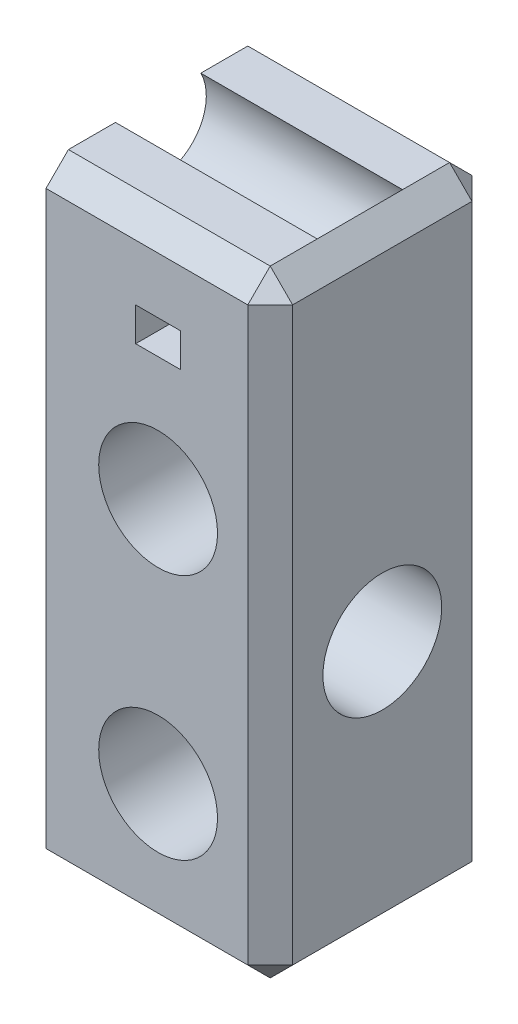
ISO-10303-21;
HEADER;
FILE_DESCRIPTION(('STEP AP214'),'2;1');
FILE_NAME('part.step','',(''),(''),'','','');
FILE_SCHEMA(('AUTOMOTIVE_DESIGN { 1 0 10303 214 1 1 1 1 }'));
ENDSEC;
DATA;
#1=APPLICATION_CONTEXT('core data for automotive mechanical design processes');
#2=APPLICATION_PROTOCOL_DEFINITION('international standard','automotive_design',2000,#1);
#3=PRODUCT_CONTEXT('',#1,'mechanical');
#4=PRODUCT('Part','Part','',(#3));
#5=PRODUCT_RELATED_PRODUCT_CATEGORY('part','',(#4));
#6=PRODUCT_DEFINITION_FORMATION('','',#4);
#7=PRODUCT_DEFINITION_CONTEXT('part definition',#1,'design');
#8=PRODUCT_DEFINITION('design','',#6,#7);
#9=PRODUCT_DEFINITION_SHAPE('','',#8);
#10=(LENGTH_UNIT() NAMED_UNIT(*) SI_UNIT(.MILLI.,.METRE.));
#11=(NAMED_UNIT(*) PLANE_ANGLE_UNIT() SI_UNIT($,.RADIAN.));
#12=(NAMED_UNIT(*) SI_UNIT($,.STERADIAN.) SOLID_ANGLE_UNIT());
#13=UNCERTAINTY_MEASURE_WITH_UNIT(LENGTH_MEASURE(1.E-05),#10,'distance_accuracy_value','');
#14=(GEOMETRIC_REPRESENTATION_CONTEXT(3) GLOBAL_UNCERTAINTY_ASSIGNED_CONTEXT((#13)) GLOBAL_UNIT_ASSIGNED_CONTEXT((#10,
#11,#12)) REPRESENTATION_CONTEXT('',''));
#15=CARTESIAN_POINT('',(0.,0.,0.));
#16=DIRECTION('',(0.,0.,1.));
#17=DIRECTION('',(1.,0.,0.));
#18=AXIS2_PLACEMENT_3D('',#15,#16,#17);
#19=CARTESIAN_POINT('',(0.,55.,0.));
#20=DIRECTION('',(0.,1.,0.));
#21=DIRECTION('',(0.,0.,1.));
#22=AXIS2_PLACEMENT_3D('',#19,#20,#21);
#23=PLANE('',#22);
#24=DIRECTION('',(0.,0.,-1.));
#25=VECTOR('',#24,1.);
#26=CARTESIAN_POINT('',(8.,55.,-10.));
#27=LINE('',#26,#25);
#28=CARTESIAN_POINT('',(8.,55.,-3.80657326213485));
#29=VERTEX_POINT('',#28);
#30=CARTESIAN_POINT('',(8.,55.,-8.));
#31=VERTEX_POINT('',#30);
#32=EDGE_CURVE('E42',#29,#31,#27,.T.);
#33=ORIENTED_EDGE('',*,*,#32,.T.);
#34=DIRECTION('',(-1.,0.,0.));
#35=VECTOR('',#34,1.);
#36=CARTESIAN_POINT('',(-10.,55.,-8.));
#37=LINE('',#36,#35);
#38=CARTESIAN_POINT('',(-10.,55.,-8.));
#39=VERTEX_POINT('',#38);
#40=EDGE_CURVE('E11',#31,#39,#37,.T.);
#41=ORIENTED_EDGE('',*,*,#40,.T.);
#42=DIRECTION('',(0.,0.,1.));
#43=VECTOR('',#42,1.);
#44=CARTESIAN_POINT('',(-10.,55.,-10.));
#45=LINE('',#44,#43);
#46=CARTESIAN_POINT('',(-10.,55.,-3.80657326213485));
#47=VERTEX_POINT('',#46);
#48=EDGE_CURVE('E173',#39,#47,#45,.T.);
#49=ORIENTED_EDGE('',*,*,#48,.T.);
#50=DIRECTION('',(-1.,0.,0.));
#51=VECTOR('',#50,1.);
#52=CARTESIAN_POINT('',(8.,55.,-3.80657326213485));
#53=LINE('',#52,#51);
#54=EDGE_CURVE('E155',#29,#47,#53,.T.);
#55=ORIENTED_EDGE('',*,*,#54,.F.);
#56=EDGE_LOOP('',(#33,#41,#49,#55));
#57=FACE_BOUND('',#56,.T.);
#58=ADVANCED_FACE('F33',(#57),#23,.T.);
#59=CARTESIAN_POINT('',(-10.,55.,-10.));
#60=DIRECTION('',(1.,0.,0.));
#61=DIRECTION('',(0.,0.,-1.));
#62=AXIS2_PLACEMENT_3D('',#59,#60,#61);
#63=PLANE('',#62);
#64=CARTESIAN_POINT('',(-10.,23.,0.));
#65=DIRECTION('',(-1.,0.,0.));
#66=DIRECTION('',(0.,0.,1.));
#67=AXIS2_PLACEMENT_3D('',#64,#65,#66);
#68=CIRCLE('',#67,5.3);
#69=CARTESIAN_POINT('',(-10.,23.,5.3));
#70=VERTEX_POINT('',#69);
#71=EDGE_CURVE('E297',#70,#70,#68,.T.);
#72=ORIENTED_EDGE('',*,*,#71,.F.);
#73=EDGE_LOOP('',(#72));
#74=FACE_BOUND('',#73,.T.);
#75=DIRECTION('',(0.,-1.,0.));
#76=VECTOR('',#75,1.);
#77=CARTESIAN_POINT('',(-10.,55.,-10.));
#78=LINE('',#77,#76);
#79=CARTESIAN_POINT('',(-10.,53.,-10.));
#80=VERTEX_POINT('',#79);
#81=CARTESIAN_POINT('',(-10.,2.,-10.));
#82=VERTEX_POINT('',#81);
#83=EDGE_CURVE('E176',#80,#82,#78,.T.);
#84=ORIENTED_EDGE('',*,*,#83,.T.);
#85=DIRECTION('',(0.,0.707106781186548,-0.707106781186548));
#86=VECTOR('',#85,1.);
#87=CARTESIAN_POINT('',(-10.,2.,-10.));
#88=LINE('',#87,#86);
#89=CARTESIAN_POINT('',(-10.,0.,-8.));
#90=VERTEX_POINT('',#89);
#91=EDGE_CURVE('E201',#82,#90,#88,.F.);
#92=ORIENTED_EDGE('',*,*,#91,.T.);
#93=DIRECTION('',(0.,0.,1.));
#94=VECTOR('',#93,1.);
#95=CARTESIAN_POINT('',(-10.,0.,-10.));
#96=LINE('',#95,#94);
#97=CARTESIAN_POINT('',(-10.,0.,8.));
#98=VERTEX_POINT('',#97);
#99=EDGE_CURVE('E174',#90,#98,#96,.T.);
#100=ORIENTED_EDGE('',*,*,#99,.T.);
#101=DIRECTION('',(0.,-0.707106781186548,-0.707106781186548));
#102=VECTOR('',#101,1.);
#103=CARTESIAN_POINT('',(-10.,2.,10.));
#104=LINE('',#103,#102);
#105=CARTESIAN_POINT('',(-10.,2.,10.));
#106=VERTEX_POINT('',#105);
#107=EDGE_CURVE('E199',#98,#106,#104,.F.);
#108=ORIENTED_EDGE('',*,*,#107,.T.);
#109=DIRECTION('',(0.,-1.,0.));
#110=VECTOR('',#109,1.);
#111=CARTESIAN_POINT('',(-10.,55.,10.));
#112=LINE('',#111,#110);
#113=CARTESIAN_POINT('',(-10.,53.,10.));
#114=VERTEX_POINT('',#113);
#115=EDGE_CURVE('E184',#114,#106,#112,.T.);
#116=ORIENTED_EDGE('',*,*,#115,.F.);
#117=DIRECTION('',(0.,0.707106781186548,-0.707106781186548));
#118=VECTOR('',#117,1.);
#119=CARTESIAN_POINT('',(-10.,55.,8.));
#120=LINE('',#119,#118);
#121=CARTESIAN_POINT('',(-10.,55.,8.));
#122=VERTEX_POINT('',#121);
#123=EDGE_CURVE('E172',#114,#122,#120,.T.);
#124=ORIENTED_EDGE('',*,*,#123,.T.);
#125=CARTESIAN_POINT('',(-10.,55.,3.80657326213486));
#126=VERTEX_POINT('',#125);
#127=EDGE_CURVE('E162',#126,#122,#45,.T.);
#128=ORIENTED_EDGE('',*,*,#127,.F.);
#129=CARTESIAN_POINT('',(-10.,53.,0.));
#130=DIRECTION('',(-1.,0.,0.));
#131=DIRECTION('',(0.,0.,1.));
#132=AXIS2_PLACEMENT_3D('',#129,#130,#131);
#133=CIRCLE('',#132,4.3);
#134=EDGE_CURVE('E149',#47,#126,#133,.T.);
#135=ORIENTED_EDGE('',*,*,#134,.F.);
#136=ORIENTED_EDGE('',*,*,#48,.F.);
#137=DIRECTION('',(0.,-0.707106781186548,-0.707106781186548));
#138=VECTOR('',#137,1.);
#139=CARTESIAN_POINT('',(-10.,55.,-8.));
#140=LINE('',#139,#138);
#141=EDGE_CURVE('E197',#39,#80,#140,.T.);
#142=ORIENTED_EDGE('',*,*,#141,.T.);
#143=EDGE_LOOP('',(#84,#92,#100,#108,#116,#124,#128,#135,#136,#142));
#144=FACE_BOUND('',#143,.T.);
#145=ADVANCED_FACE('F169',(#74,#144),#63,.F.);
#146=CARTESIAN_POINT('',(-10.,55.,10.));
#147=DIRECTION('',(0.,0.,-1.));
#148=DIRECTION('',(-1.,0.,0.));
#149=AXIS2_PLACEMENT_3D('',#146,#147,#148);
#150=PLANE('',#149);
#151=ORIENTED_EDGE('',*,*,#115,.T.);
#152=DIRECTION('',(1.,0.,0.));
#153=VECTOR('',#152,1.);
#154=CARTESIAN_POINT('',(-10.,2.,10.));
#155=LINE('',#154,#153);
#156=CARTESIAN_POINT('',(8.,2.,10.));
#157=VERTEX_POINT('',#156);
#158=EDGE_CURVE('E222',#106,#157,#155,.T.);
#159=ORIENTED_EDGE('',*,*,#158,.T.);
#160=DIRECTION('',(0.,1.,0.));
#161=VECTOR('',#160,1.);
#162=CARTESIAN_POINT('',(8.,55.,10.));
#163=LINE('',#162,#161);
#164=CARTESIAN_POINT('',(8.,53.,10.));
#165=VERTEX_POINT('',#164);
#166=EDGE_CURVE('E218',#157,#165,#163,.T.);
#167=ORIENTED_EDGE('',*,*,#166,.T.);
#168=DIRECTION('',(-1.,0.,0.));
#169=VECTOR('',#168,1.);
#170=CARTESIAN_POINT('',(-10.,53.,10.));
#171=LINE('',#170,#169);
#172=EDGE_CURVE('E220',#165,#114,#171,.T.);
#173=ORIENTED_EDGE('',*,*,#172,.T.);
#174=EDGE_LOOP('',(#151,#159,#167,#173));
#175=FACE_BOUND('',#174,.T.);
#176=CARTESIAN_POINT('',(0.,34.,10.));
#177=DIRECTION('',(0.,0.,-1.));
#178=DIRECTION('',(-1.,0.,0.));
#179=AXIS2_PLACEMENT_3D('',#176,#177,#178);
#180=CIRCLE('',#179,5.3);
#181=CARTESIAN_POINT('',(-5.3,34.,10.));
#182=VERTEX_POINT('',#181);
#183=EDGE_CURVE('E569',#182,#182,#180,.T.);
#184=ORIENTED_EDGE('',*,*,#183,.T.);
#185=EDGE_LOOP('',(#184));
#186=FACE_BOUND('',#185,.T.);
#187=DIRECTION('',(-1.,0.,0.));
#188=VECTOR('',#187,1.);
#189=CARTESIAN_POINT('',(-10.,45.,10.));
#190=LINE('',#189,#188);
#191=CARTESIAN_POINT('',(2.,45.,10.));
#192=VERTEX_POINT('',#191);
#193=CARTESIAN_POINT('',(-2.,45.,10.));
#194=VERTEX_POINT('',#193);
#195=EDGE_CURVE('E583',#192,#194,#190,.T.);
#196=ORIENTED_EDGE('',*,*,#195,.T.);
#197=DIRECTION('',(0.,1.,0.));
#198=VECTOR('',#197,1.);
#199=CARTESIAN_POINT('',(-2.,55.,10.));
#200=LINE('',#199,#198);
#201=CARTESIAN_POINT('',(-2.,48.,10.));
#202=VERTEX_POINT('',#201);
#203=EDGE_CURVE('E572',#194,#202,#200,.T.);
#204=ORIENTED_EDGE('',*,*,#203,.T.);
#205=DIRECTION('',(1.,0.,0.));
#206=VECTOR('',#205,1.);
#207=CARTESIAN_POINT('',(-10.,48.,10.));
#208=LINE('',#207,#206);
#209=CARTESIAN_POINT('',(2.,48.,10.));
#210=VERTEX_POINT('',#209);
#211=EDGE_CURVE('E577',#202,#210,#208,.T.);
#212=ORIENTED_EDGE('',*,*,#211,.T.);
#213=DIRECTION('',(0.,-1.,0.));
#214=VECTOR('',#213,1.);
#215=CARTESIAN_POINT('',(2.,55.,10.));
#216=LINE('',#215,#214);
#217=EDGE_CURVE('E580',#210,#192,#216,.T.);
#218=ORIENTED_EDGE('',*,*,#217,.T.);
#219=EDGE_LOOP('',(#196,#204,#212,#218));
#220=FACE_BOUND('',#219,.T.);
#221=CARTESIAN_POINT('',(0.,12.,10.));
#222=DIRECTION('',(0.,0.,-1.));
#223=DIRECTION('',(-1.,0.,0.));
#224=AXIS2_PLACEMENT_3D('',#221,#222,#223);
#225=CIRCLE('',#224,5.3);
#226=CARTESIAN_POINT('',(-5.3,12.,10.));
#227=VERTEX_POINT('',#226);
#228=EDGE_CURVE('E178',#227,#227,#225,.T.);
#229=ORIENTED_EDGE('',*,*,#228,.T.);
#230=EDGE_LOOP('',(#229));
#231=FACE_BOUND('',#230,.T.);
#232=ADVANCED_FACE('F268',(#175,#186,#220,#231),#150,.F.);
#233=CARTESIAN_POINT('',(10.,55.,-10.));
#234=DIRECTION('',(-1.,0.,0.));
#235=DIRECTION('',(0.,0.,1.));
#236=AXIS2_PLACEMENT_3D('',#233,#234,#235);
#237=PLANE('',#236);
#238=DIRECTION('',(0.,-1.,0.));
#239=VECTOR('',#238,1.);
#240=CARTESIAN_POINT('',(10.,55.,8.));
#241=LINE('',#240,#239);
#242=CARTESIAN_POINT('',(10.,53.,8.));
#243=VERTEX_POINT('',#242);
#244=CARTESIAN_POINT('',(10.,2.,8.));
#245=VERTEX_POINT('',#244);
#246=EDGE_CURVE('E209',#243,#245,#241,.T.);
#247=ORIENTED_EDGE('',*,*,#246,.T.);
#248=DIRECTION('',(0.,0.,-1.));
#249=VECTOR('',#248,1.);
#250=CARTESIAN_POINT('',(10.,2.,-10.));
#251=LINE('',#250,#249);
#252=CARTESIAN_POINT('',(10.,2.,-8.));
#253=VERTEX_POINT('',#252);
#254=EDGE_CURVE('E215',#245,#253,#251,.T.);
#255=ORIENTED_EDGE('',*,*,#254,.T.);
#256=DIRECTION('',(0.,1.,0.));
#257=VECTOR('',#256,1.);
#258=CARTESIAN_POINT('',(10.,55.,-8.));
#259=LINE('',#258,#257);
#260=CARTESIAN_POINT('',(10.,53.,-8.));
#261=VERTEX_POINT('',#260);
#262=EDGE_CURVE('E213',#253,#261,#259,.T.);
#263=ORIENTED_EDGE('',*,*,#262,.T.);
#264=DIRECTION('',(0.,0.,1.));
#265=VECTOR('',#264,1.);
#266=CARTESIAN_POINT('',(10.,53.,10.));
#267=LINE('',#266,#265);
#268=EDGE_CURVE('E211',#261,#243,#267,.T.);
#269=ORIENTED_EDGE('',*,*,#268,.T.);
#270=EDGE_LOOP('',(#247,#255,#263,#269));
#271=FACE_BOUND('',#270,.T.);
#272=CARTESIAN_POINT('',(10.,23.,0.));
#273=DIRECTION('',(-1.,0.,0.));
#274=DIRECTION('',(0.,0.,1.));
#275=AXIS2_PLACEMENT_3D('',#272,#273,#274);
#276=CIRCLE('',#275,5.3);
#277=CARTESIAN_POINT('',(10.,23.,5.3));
#278=VERTEX_POINT('',#277);
#279=EDGE_CURVE('E610',#278,#278,#276,.T.);
#280=ORIENTED_EDGE('',*,*,#279,.T.);
#281=EDGE_LOOP('',(#280));
#282=FACE_BOUND('',#281,.T.);
#283=ADVANCED_FACE('F289',(#271,#282),#237,.F.);
#284=CARTESIAN_POINT('',(-10.,55.,-10.));
#285=DIRECTION('',(0.,0.,1.));
#286=DIRECTION('',(1.,0.,0.));
#287=AXIS2_PLACEMENT_3D('',#284,#285,#286);
#288=PLANE('',#287);
#289=CARTESIAN_POINT('',(0.,34.,-10.));
#290=DIRECTION('',(0.,0.,1.));
#291=DIRECTION('',(1.,0.,0.));
#292=AXIS2_PLACEMENT_3D('',#289,#290,#291);
#293=CIRCLE('',#292,5.3);
#294=CARTESIAN_POINT('',(5.3,34.,-10.));
#295=VERTEX_POINT('',#294);
#296=EDGE_CURVE('E586',#295,#295,#293,.T.);
#297=ORIENTED_EDGE('',*,*,#296,.T.);
#298=EDGE_LOOP('',(#297));
#299=FACE_BOUND('',#298,.T.);
#300=DIRECTION('',(-1.,0.,0.));
#301=VECTOR('',#300,1.);
#302=CARTESIAN_POINT('',(-2.,48.,-10.));
#303=LINE('',#302,#301);
#304=CARTESIAN_POINT('',(2.,48.,-10.));
#305=VERTEX_POINT('',#304);
#306=CARTESIAN_POINT('',(-2.,48.,-10.));
#307=VERTEX_POINT('',#306);
#308=EDGE_CURVE('E590',#305,#307,#303,.T.);
#309=ORIENTED_EDGE('',*,*,#308,.T.);
#310=DIRECTION('',(0.,-1.,0.));
#311=VECTOR('',#310,1.);
#312=CARTESIAN_POINT('',(-2.,48.,-10.));
#313=LINE('',#312,#311);
#314=CARTESIAN_POINT('',(-2.,45.,-10.));
#315=VERTEX_POINT('',#314);
#316=EDGE_CURVE('E607',#307,#315,#313,.T.);
#317=ORIENTED_EDGE('',*,*,#316,.T.);
#318=DIRECTION('',(1.,0.,0.));
#319=VECTOR('',#318,1.);
#320=CARTESIAN_POINT('',(-2.,45.,-10.));
#321=LINE('',#320,#319);
#322=CARTESIAN_POINT('',(2.,45.,-10.));
#323=VERTEX_POINT('',#322);
#324=EDGE_CURVE('E604',#315,#323,#321,.T.);
#325=ORIENTED_EDGE('',*,*,#324,.T.);
#326=DIRECTION('',(0.,1.,0.));
#327=VECTOR('',#326,1.);
#328=CARTESIAN_POINT('',(2.,48.,-10.));
#329=LINE('',#328,#327);
#330=EDGE_CURVE('E601',#323,#305,#329,.T.);
#331=ORIENTED_EDGE('',*,*,#330,.T.);
#332=EDGE_LOOP('',(#309,#317,#325,#331));
#333=FACE_BOUND('',#332,.T.);
#334=CARTESIAN_POINT('',(0.,12.,-10.));
#335=DIRECTION('',(0.,0.,1.));
#336=DIRECTION('',(1.,0.,0.));
#337=AXIS2_PLACEMENT_3D('',#334,#335,#336);
#338=CIRCLE('',#337,5.3);
#339=CARTESIAN_POINT('',(5.3,12.,-10.));
#340=VERTEX_POINT('',#339);
#341=EDGE_CURVE('E565',#340,#340,#338,.T.);
#342=ORIENTED_EDGE('',*,*,#341,.T.);
#343=EDGE_LOOP('',(#342));
#344=FACE_BOUND('',#343,.T.);
#345=DIRECTION('',(0.,-1.,0.));
#346=VECTOR('',#345,1.);
#347=CARTESIAN_POINT('',(8.,55.,-10.));
#348=LINE('',#347,#346);
#349=CARTESIAN_POINT('',(8.,53.,-10.));
#350=VERTEX_POINT('',#349);
#351=CARTESIAN_POINT('',(8.,2.,-10.));
#352=VERTEX_POINT('',#351);
#353=EDGE_CURVE('E191',#350,#352,#348,.T.);
#354=ORIENTED_EDGE('',*,*,#353,.T.);
#355=DIRECTION('',(-1.,0.,0.));
#356=VECTOR('',#355,1.);
#357=CARTESIAN_POINT('',(-10.,2.,-10.));
#358=LINE('',#357,#356);
#359=EDGE_CURVE('E193',#352,#82,#358,.T.);
#360=ORIENTED_EDGE('',*,*,#359,.T.);
#361=ORIENTED_EDGE('',*,*,#83,.F.);
#362=DIRECTION('',(1.,0.,0.));
#363=VECTOR('',#362,1.);
#364=CARTESIAN_POINT('',(10.,53.,-10.));
#365=LINE('',#364,#363);
#366=EDGE_CURVE('E189',#80,#350,#365,.T.);
#367=ORIENTED_EDGE('',*,*,#366,.T.);
#368=EDGE_LOOP('',(#354,#360,#361,#367));
#369=FACE_BOUND('',#368,.T.);
#370=ADVANCED_FACE('F307',(#299,#333,#344,#369),#288,.F.);
#371=DIRECTION('',(1.,0.,0.));
#372=VECTOR('',#371,1.);
#373=CARTESIAN_POINT('',(10.,55.,8.));
#374=LINE('',#373,#372);
#375=CARTESIAN_POINT('',(8.,55.,8.));
#376=VERTEX_POINT('',#375);
#377=EDGE_CURVE('E56',#122,#376,#374,.T.);
#378=ORIENTED_EDGE('',*,*,#377,.T.);
#379=DIRECTION('',(0.,0.,-1.));
#380=VECTOR('',#379,1.);
#381=CARTESIAN_POINT('',(8.,55.,-10.));
#382=LINE('',#381,#380);
#383=CARTESIAN_POINT('',(8.,55.,3.80657326213485));
#384=VERTEX_POINT('',#383);
#385=EDGE_CURVE('E164',#376,#384,#382,.T.);
#386=ORIENTED_EDGE('',*,*,#385,.T.);
#387=DIRECTION('',(-1.,0.,0.));
#388=VECTOR('',#387,1.);
#389=CARTESIAN_POINT('',(8.,55.,3.80657326213485));
#390=LINE('',#389,#388);
#391=EDGE_CURVE('E153',#126,#384,#390,.F.);
#392=ORIENTED_EDGE('',*,*,#391,.F.);
#393=ORIENTED_EDGE('',*,*,#127,.T.);
#394=EDGE_LOOP('',(#378,#386,#392,#393));
#395=FACE_BOUND('',#394,.T.);
#396=ADVANCED_FACE('F161',(#395),#23,.T.);
#397=CARTESIAN_POINT('',(0.,0.,0.));
#398=DIRECTION('',(0.,1.,0.));
#399=DIRECTION('',(0.,0.,1.));
#400=AXIS2_PLACEMENT_3D('',#397,#398,#399);
#401=PLANE('',#400);
#402=ORIENTED_EDGE('',*,*,#99,.F.);
#403=DIRECTION('',(1.,0.,0.));
#404=VECTOR('',#403,1.);
#405=CARTESIAN_POINT('',(0.,0.,-8.));
#406=LINE('',#405,#404);
#407=CARTESIAN_POINT('',(8.,0.,-8.));
#408=VERTEX_POINT('',#407);
#409=EDGE_CURVE('E207',#90,#408,#406,.T.);
#410=ORIENTED_EDGE('',*,*,#409,.T.);
#411=DIRECTION('',(0.,0.,1.));
#412=VECTOR('',#411,1.);
#413=CARTESIAN_POINT('',(8.,0.,0.));
#414=LINE('',#413,#412);
#415=CARTESIAN_POINT('',(8.,0.,8.));
#416=VERTEX_POINT('',#415);
#417=EDGE_CURVE('E205',#408,#416,#414,.T.);
#418=ORIENTED_EDGE('',*,*,#417,.T.);
#419=DIRECTION('',(-1.,0.,0.));
#420=VECTOR('',#419,1.);
#421=CARTESIAN_POINT('',(0.,0.,8.));
#422=LINE('',#421,#420);
#423=EDGE_CURVE('E203',#416,#98,#422,.T.);
#424=ORIENTED_EDGE('',*,*,#423,.T.);
#425=EDGE_LOOP('',(#402,#410,#418,#424));
#426=FACE_BOUND('',#425,.T.);
#427=ADVANCED_FACE('F314',(#426),#401,.F.);
#428=CARTESIAN_POINT('',(0.,12.,-10.));
#429=DIRECTION('',(0.,0.,1.));
#430=DIRECTION('',(1.,0.,0.));
#431=AXIS2_PLACEMENT_3D('',#428,#429,#430);
#432=CYLINDRICAL_SURFACE('',#431,5.3);
#433=ORIENTED_EDGE('',*,*,#341,.F.);
#434=EDGE_LOOP('',(#433));
#435=FACE_BOUND('',#434,.T.);
#436=ORIENTED_EDGE('',*,*,#228,.F.);
#437=EDGE_LOOP('',(#436));
#438=FACE_BOUND('',#437,.T.);
#439=ADVANCED_FACE('F345',(#435,#438),#432,.F.);
#440=CARTESIAN_POINT('',(-2.,48.,-10.));
#441=DIRECTION('',(-1.,0.,0.));
#442=DIRECTION('',(0.,-1.,0.));
#443=AXIS2_PLACEMENT_3D('',#440,#441,#442);
#444=PLANE('',#443);
#445=DIRECTION('',(0.,0.,1.));
#446=VECTOR('',#445,1.);
#447=CARTESIAN_POINT('',(-2.,45.,-10.));
#448=LINE('',#447,#446);
#449=EDGE_CURVE('E587',#315,#194,#448,.T.);
#450=ORIENTED_EDGE('',*,*,#449,.F.);
#451=ORIENTED_EDGE('',*,*,#316,.F.);
#452=DIRECTION('',(0.,0.,1.));
#453=VECTOR('',#452,1.);
#454=CARTESIAN_POINT('',(-2.,48.,-10.));
#455=LINE('',#454,#453);
#456=EDGE_CURVE('E596',#307,#202,#455,.T.);
#457=ORIENTED_EDGE('',*,*,#456,.T.);
#458=ORIENTED_EDGE('',*,*,#203,.F.);
#459=EDGE_LOOP('',(#450,#451,#457,#458));
#460=FACE_BOUND('',#459,.T.);
#461=ADVANCED_FACE('F498',(#460),#444,.F.);
#462=CARTESIAN_POINT('',(-2.,48.,-10.));
#463=DIRECTION('',(0.,1.,0.));
#464=DIRECTION('',(0.,0.,1.));
#465=AXIS2_PLACEMENT_3D('',#462,#463,#464);
#466=PLANE('',#465);
#467=ORIENTED_EDGE('',*,*,#456,.F.);
#468=ORIENTED_EDGE('',*,*,#308,.F.);
#469=DIRECTION('',(0.,0.,1.));
#470=VECTOR('',#469,1.);
#471=CARTESIAN_POINT('',(2.,48.,-10.));
#472=LINE('',#471,#470);
#473=EDGE_CURVE('E593',#305,#210,#472,.T.);
#474=ORIENTED_EDGE('',*,*,#473,.T.);
#475=ORIENTED_EDGE('',*,*,#211,.F.);
#476=EDGE_LOOP('',(#467,#468,#474,#475));
#477=FACE_BOUND('',#476,.T.);
#478=ADVANCED_FACE('F489',(#477),#466,.F.);
#479=CARTESIAN_POINT('',(2.,48.,-10.));
#480=DIRECTION('',(1.,0.,0.));
#481=DIRECTION('',(0.,0.,-1.));
#482=AXIS2_PLACEMENT_3D('',#479,#480,#481);
#483=PLANE('',#482);
#484=ORIENTED_EDGE('',*,*,#473,.F.);
#485=ORIENTED_EDGE('',*,*,#330,.F.);
#486=DIRECTION('',(0.,0.,1.));
#487=VECTOR('',#486,1.);
#488=CARTESIAN_POINT('',(2.,45.,-10.));
#489=LINE('',#488,#487);
#490=EDGE_CURVE('E589',#323,#192,#489,.T.);
#491=ORIENTED_EDGE('',*,*,#490,.T.);
#492=ORIENTED_EDGE('',*,*,#217,.F.);
#493=EDGE_LOOP('',(#484,#485,#491,#492));
#494=FACE_BOUND('',#493,.T.);
#495=ADVANCED_FACE('F480',(#494),#483,.F.);
#496=CARTESIAN_POINT('',(-2.,45.,-10.));
#497=DIRECTION('',(0.,-1.,0.));
#498=DIRECTION('',(0.,0.,-1.));
#499=AXIS2_PLACEMENT_3D('',#496,#497,#498);
#500=PLANE('',#499);
#501=ORIENTED_EDGE('',*,*,#490,.F.);
#502=ORIENTED_EDGE('',*,*,#324,.F.);
#503=ORIENTED_EDGE('',*,*,#449,.T.);
#504=ORIENTED_EDGE('',*,*,#195,.F.);
#505=EDGE_LOOP('',(#501,#502,#503,#504));
#506=FACE_BOUND('',#505,.T.);
#507=ADVANCED_FACE('F471',(#506),#500,.F.);
#508=CARTESIAN_POINT('',(0.,34.,-10.));
#509=DIRECTION('',(0.,0.,1.));
#510=DIRECTION('',(1.,0.,0.));
#511=AXIS2_PLACEMENT_3D('',#508,#509,#510);
#512=CYLINDRICAL_SURFACE('',#511,5.3);
#513=ORIENTED_EDGE('',*,*,#296,.F.);
#514=EDGE_LOOP('',(#513));
#515=FACE_BOUND('',#514,.T.);
#516=ORIENTED_EDGE('',*,*,#183,.F.);
#517=EDGE_LOOP('',(#516));
#518=FACE_BOUND('',#517,.T.);
#519=ADVANCED_FACE('F462',(#515,#518),#512,.F.);
#520=CARTESIAN_POINT('',(10.,23.,0.));
#521=DIRECTION('',(-1.,0.,0.));
#522=DIRECTION('',(0.,0.,1.));
#523=AXIS2_PLACEMENT_3D('',#520,#521,#522);
#524=CYLINDRICAL_SURFACE('',#523,5.3);
#525=ORIENTED_EDGE('',*,*,#279,.F.);
#526=EDGE_LOOP('',(#525));
#527=FACE_BOUND('',#526,.T.);
#528=ORIENTED_EDGE('',*,*,#71,.T.);
#529=EDGE_LOOP('',(#528));
#530=FACE_BOUND('',#529,.T.);
#531=ADVANCED_FACE('F454',(#527,#530),#524,.F.);
#532=CARTESIAN_POINT('',(8.,53.,0.));
#533=DIRECTION('',(-1.,0.,0.));
#534=DIRECTION('',(0.,0.,1.));
#535=AXIS2_PLACEMENT_3D('',#532,#533,#534);
#536=CYLINDRICAL_SURFACE('',#535,4.3);
#537=ORIENTED_EDGE('',*,*,#54,.T.);
#538=ORIENTED_EDGE('',*,*,#134,.T.);
#539=ORIENTED_EDGE('',*,*,#391,.T.);
#540=CARTESIAN_POINT('',(8.,53.,0.));
#541=DIRECTION('',(-1.,0.,0.));
#542=DIRECTION('',(0.,0.,1.));
#543=AXIS2_PLACEMENT_3D('',#540,#541,#542);
#544=CIRCLE('',#543,4.3);
#545=EDGE_CURVE('E159',#29,#384,#544,.T.);
#546=ORIENTED_EDGE('',*,*,#545,.F.);
#547=EDGE_LOOP('',(#537,#538,#539,#546));
#548=FACE_BOUND('',#547,.T.);
#549=ADVANCED_FACE('F151',(#548),#536,.F.);
#550=CARTESIAN_POINT('',(8.,53.,0.));
#551=DIRECTION('',(-1.,0.,0.));
#552=DIRECTION('',(0.,0.,1.));
#553=AXIS2_PLACEMENT_3D('',#550,#551,#552);
#554=PLANE('',#553);
#555=ORIENTED_EDGE('',*,*,#545,.T.);
#556=DIRECTION('',(0.,0.,1.));
#557=VECTOR('',#556,1.);
#558=CARTESIAN_POINT('',(8.,55.,0.));
#559=LINE('',#558,#557);
#560=EDGE_CURVE('E166',#29,#384,#559,.T.);
#561=ORIENTED_EDGE('',*,*,#560,.F.);
#562=EDGE_LOOP('',(#555,#561));
#563=FACE_BOUND('',#562,.T.);
#564=ADVANCED_FACE('F296',(#563),#554,.T.);
#565=CARTESIAN_POINT('',(0.,55.,8.));
#566=DIRECTION('',(0.,0.707106781186547,0.707106781186547));
#567=DIRECTION('',(-1.,0.,0.));
#568=AXIS2_PLACEMENT_3D('',#565,#566,#567);
#569=PLANE('',#568);
#570=DIRECTION('',(0.,-0.707106781186547,0.707106781186547));
#571=VECTOR('',#570,1.);
#572=CARTESIAN_POINT('',(8.,54.,9.));
#573=LINE('',#572,#571);
#574=EDGE_CURVE('E37',#376,#165,#573,.T.);
#575=ORIENTED_EDGE('',*,*,#574,.F.);
#576=ORIENTED_EDGE('',*,*,#377,.F.);
#577=ORIENTED_EDGE('',*,*,#123,.F.);
#578=ORIENTED_EDGE('',*,*,#172,.F.);
#579=EDGE_LOOP('',(#575,#576,#577,#578));
#580=FACE_BOUND('',#579,.T.);
#581=ADVANCED_FACE('F35',(#580),#569,.T.);
#582=CARTESIAN_POINT('',(10.,53.,8.));
#583=DIRECTION('',(0.577350269189626,0.577350269189626,0.577350269189626));
#584=DIRECTION('',(0.,-0.707106781186547,0.707106781186548));
#585=AXIS2_PLACEMENT_3D('',#582,#583,#584);
#586=PLANE('',#585);
#587=DIRECTION('',(-0.707106781186548,0.707106781186547,0.));
#588=VECTOR('',#587,1.);
#589=CARTESIAN_POINT('',(10.,53.,8.));
#590=LINE('',#589,#588);
#591=EDGE_CURVE('E253',#376,#243,#590,.F.);
#592=ORIENTED_EDGE('',*,*,#591,.F.);
#593=ORIENTED_EDGE('',*,*,#574,.T.);
#594=DIRECTION('',(-0.707106781186548,0.,0.707106781186548));
#595=VECTOR('',#594,1.);
#596=CARTESIAN_POINT('',(10.,53.,8.));
#597=LINE('',#596,#595);
#598=EDGE_CURVE('E255',#243,#165,#597,.T.);
#599=ORIENTED_EDGE('',*,*,#598,.F.);
#600=EDGE_LOOP('',(#592,#593,#599));
#601=FACE_BOUND('',#600,.T.);
#602=ADVANCED_FACE('F264',(#601),#586,.T.);
#603=CARTESIAN_POINT('',(-10.,2.,10.));
#604=DIRECTION('',(0.,0.707106781186547,-0.707106781186547));
#605=DIRECTION('',(1.,0.,0.));
#606=AXIS2_PLACEMENT_3D('',#603,#604,#605);
#607=PLANE('',#606);
#608=ORIENTED_EDGE('',*,*,#107,.F.);
#609=ORIENTED_EDGE('',*,*,#423,.F.);
#610=DIRECTION('',(0.,0.707106781186547,0.707106781186547));
#611=VECTOR('',#610,1.);
#612=CARTESIAN_POINT('',(8.,0.,8.));
#613=LINE('',#612,#611);
#614=EDGE_CURVE('E250',#157,#416,#613,.F.);
#615=ORIENTED_EDGE('',*,*,#614,.F.);
#616=ORIENTED_EDGE('',*,*,#158,.F.);
#617=EDGE_LOOP('',(#608,#609,#615,#616));
#618=FACE_BOUND('',#617,.T.);
#619=ADVANCED_FACE('F275',(#618),#607,.F.);
#620=CARTESIAN_POINT('',(10.,55.,8.));
#621=DIRECTION('',(-0.707106781186547,0.,-0.707106781186547));
#622=DIRECTION('',(0.,-1.,0.));
#623=AXIS2_PLACEMENT_3D('',#620,#621,#622);
#624=PLANE('',#623);
#625=ORIENTED_EDGE('',*,*,#598,.T.);
#626=ORIENTED_EDGE('',*,*,#166,.F.);
#627=DIRECTION('',(0.707106781186548,0.,-0.707106781186548));
#628=VECTOR('',#627,1.);
#629=CARTESIAN_POINT('',(9.00000000000001,2.,9.));
#630=LINE('',#629,#628);
#631=EDGE_CURVE('E247',#245,#157,#630,.F.);
#632=ORIENTED_EDGE('',*,*,#631,.F.);
#633=ORIENTED_EDGE('',*,*,#246,.F.);
#634=EDGE_LOOP('',(#625,#626,#632,#633));
#635=FACE_BOUND('',#634,.T.);
#636=ADVANCED_FACE('F278',(#635),#624,.F.);
#637=CARTESIAN_POINT('',(8.,55.,0.));
#638=DIRECTION('',(0.707106781186547,0.707106781186548,0.));
#639=DIRECTION('',(0.,0.,1.));
#640=AXIS2_PLACEMENT_3D('',#637,#638,#639);
#641=PLANE('',#640);
#642=ORIENTED_EDGE('',*,*,#591,.T.);
#643=ORIENTED_EDGE('',*,*,#268,.F.);
#644=DIRECTION('',(0.707106781186548,-0.707106781186547,0.));
#645=VECTOR('',#644,1.);
#646=CARTESIAN_POINT('',(10.,53.,-8.));
#647=LINE('',#646,#645);
#648=EDGE_CURVE('E244',#31,#261,#647,.T.);
#649=ORIENTED_EDGE('',*,*,#648,.F.);
#650=ORIENTED_EDGE('',*,*,#32,.F.);
#651=ORIENTED_EDGE('',*,*,#560,.T.);
#652=ORIENTED_EDGE('',*,*,#385,.F.);
#653=EDGE_LOOP('',(#642,#643,#649,#650,#651,#652));
#654=FACE_BOUND('',#653,.T.);
#655=ADVANCED_FACE('F294',(#654),#641,.T.);
#656=CARTESIAN_POINT('',(0.,55.,-8.));
#657=DIRECTION('',(0.,0.707106781186547,-0.707106781186547));
#658=DIRECTION('',(1.,0.,0.));
#659=AXIS2_PLACEMENT_3D('',#656,#657,#658);
#660=PLANE('',#659);
#661=ORIENTED_EDGE('',*,*,#141,.F.);
#662=ORIENTED_EDGE('',*,*,#40,.F.);
#663=DIRECTION('',(0.,0.707106781186547,0.707106781186547));
#664=VECTOR('',#663,1.);
#665=CARTESIAN_POINT('',(8.,54.,-9.));
#666=LINE('',#665,#664);
#667=EDGE_CURVE('E241',#350,#31,#666,.T.);
#668=ORIENTED_EDGE('',*,*,#667,.F.);
#669=ORIENTED_EDGE('',*,*,#366,.F.);
#670=EDGE_LOOP('',(#661,#662,#668,#669));
#671=FACE_BOUND('',#670,.T.);
#672=ADVANCED_FACE('F303',(#671),#660,.T.);
#673=CARTESIAN_POINT('',(8.,0.,8.));
#674=DIRECTION('',(0.577350269189626,-0.577350269189626,0.577350269189626));
#675=DIRECTION('',(0.,-0.707106781186547,-0.707106781186548));
#676=AXIS2_PLACEMENT_3D('',#673,#674,#675);
#677=PLANE('',#676);
#678=ORIENTED_EDGE('',*,*,#631,.T.);
#679=ORIENTED_EDGE('',*,*,#614,.T.);
#680=DIRECTION('',(-0.707106781186548,-0.707106781186547,0.));
#681=VECTOR('',#680,1.);
#682=CARTESIAN_POINT('',(8.,0.,8.));
#683=LINE('',#682,#681);
#684=EDGE_CURVE('E238',#245,#416,#683,.T.);
#685=ORIENTED_EDGE('',*,*,#684,.F.);
#686=EDGE_LOOP('',(#678,#679,#685));
#687=FACE_BOUND('',#686,.T.);
#688=ADVANCED_FACE('F282',(#687),#677,.T.);
#689=CARTESIAN_POINT('',(10.,53.,-8.));
#690=DIRECTION('',(0.577350269189626,0.577350269189626,-0.577350269189626));
#691=DIRECTION('',(0.,0.707106781186547,0.707106781186548));
#692=AXIS2_PLACEMENT_3D('',#689,#690,#691);
#693=PLANE('',#692);
#694=ORIENTED_EDGE('',*,*,#667,.T.);
#695=ORIENTED_EDGE('',*,*,#648,.T.);
#696=DIRECTION('',(0.707106781186548,0.,0.707106781186548));
#697=VECTOR('',#696,1.);
#698=CARTESIAN_POINT('',(10.,53.,-8.));
#699=LINE('',#698,#697);
#700=EDGE_CURVE('E235',#350,#261,#699,.T.);
#701=ORIENTED_EDGE('',*,*,#700,.F.);
#702=EDGE_LOOP('',(#694,#695,#701));
#703=FACE_BOUND('',#702,.T.);
#704=ADVANCED_FACE('F322',(#703),#693,.T.);
#705=CARTESIAN_POINT('',(10.,2.,-10.));
#706=DIRECTION('',(-0.707106781186547,0.707106781186548,0.));
#707=DIRECTION('',(0.,0.,-1.));
#708=AXIS2_PLACEMENT_3D('',#705,#706,#707);
#709=PLANE('',#708);
#710=ORIENTED_EDGE('',*,*,#684,.T.);
#711=ORIENTED_EDGE('',*,*,#417,.F.);
#712=DIRECTION('',(0.707106781186548,0.707106781186547,0.));
#713=VECTOR('',#712,1.);
#714=CARTESIAN_POINT('',(8.,0.,-8.));
#715=LINE('',#714,#713);
#716=EDGE_CURVE('E232',#253,#408,#715,.F.);
#717=ORIENTED_EDGE('',*,*,#716,.F.);
#718=ORIENTED_EDGE('',*,*,#254,.F.);
#719=EDGE_LOOP('',(#710,#711,#717,#718));
#720=FACE_BOUND('',#719,.T.);
#721=ADVANCED_FACE('F286',(#720),#709,.F.);
#722=CARTESIAN_POINT('',(8.,55.,-10.));
#723=DIRECTION('',(-0.707106781186547,0.,0.707106781186547));
#724=DIRECTION('',(0.,-1.,0.));
#725=AXIS2_PLACEMENT_3D('',#722,#723,#724);
#726=PLANE('',#725);
#727=ORIENTED_EDGE('',*,*,#700,.T.);
#728=ORIENTED_EDGE('',*,*,#262,.F.);
#729=DIRECTION('',(-0.707106781186548,0.,-0.707106781186548));
#730=VECTOR('',#729,1.);
#731=CARTESIAN_POINT('',(9.,2.,-9.));
#732=LINE('',#731,#730);
#733=EDGE_CURVE('E230',#352,#253,#732,.F.);
#734=ORIENTED_EDGE('',*,*,#733,.F.);
#735=ORIENTED_EDGE('',*,*,#353,.F.);
#736=EDGE_LOOP('',(#727,#728,#734,#735));
#737=FACE_BOUND('',#736,.T.);
#738=ADVANCED_FACE('F320',(#737),#726,.F.);
#739=CARTESIAN_POINT('',(8.,0.,-8.));
#740=DIRECTION('',(0.577350269189626,-0.577350269189626,-0.577350269189626));
#741=DIRECTION('',(0.,0.707106781186547,-0.707106781186548));
#742=AXIS2_PLACEMENT_3D('',#739,#740,#741);
#743=PLANE('',#742);
#744=ORIENTED_EDGE('',*,*,#733,.T.);
#745=ORIENTED_EDGE('',*,*,#716,.T.);
#746=DIRECTION('',(0.,-0.707106781186547,0.707106781186547));
#747=VECTOR('',#746,1.);
#748=CARTESIAN_POINT('',(8.,0.,-8.));
#749=LINE('',#748,#747);
#750=EDGE_CURVE('E227',#352,#408,#749,.T.);
#751=ORIENTED_EDGE('',*,*,#750,.F.);
#752=EDGE_LOOP('',(#744,#745,#751));
#753=FACE_BOUND('',#752,.T.);
#754=ADVANCED_FACE('F318',(#753),#743,.T.);
#755=CARTESIAN_POINT('',(-10.,2.,-10.));
#756=DIRECTION('',(0.,0.707106781186547,0.707106781186547));
#757=DIRECTION('',(-1.,0.,0.));
#758=AXIS2_PLACEMENT_3D('',#755,#756,#757);
#759=PLANE('',#758);
#760=ORIENTED_EDGE('',*,*,#750,.T.);
#761=ORIENTED_EDGE('',*,*,#409,.F.);
#762=ORIENTED_EDGE('',*,*,#91,.F.);
#763=ORIENTED_EDGE('',*,*,#359,.F.);
#764=EDGE_LOOP('',(#760,#761,#762,#763));
#765=FACE_BOUND('',#764,.T.);
#766=ADVANCED_FACE('F315',(#765),#759,.F.);
#767=CLOSED_SHELL('',(#58,#145,#232,#283,#370,#396,#427,#439,#461,#478,#495,#507,#519,#531,#549,
#564,#581,#602,#619,#636,#655,#672,#688,#704,#721,#738,#754,#766));
#768=MANIFOLD_SOLID_BREP('B2',#767);
#769=ADVANCED_BREP_SHAPE_REPRESENTATION('',(#18,#768),#14);
#770=SHAPE_DEFINITION_REPRESENTATION(#9,#769);
ENDSEC;
END-ISO-10303-21;
